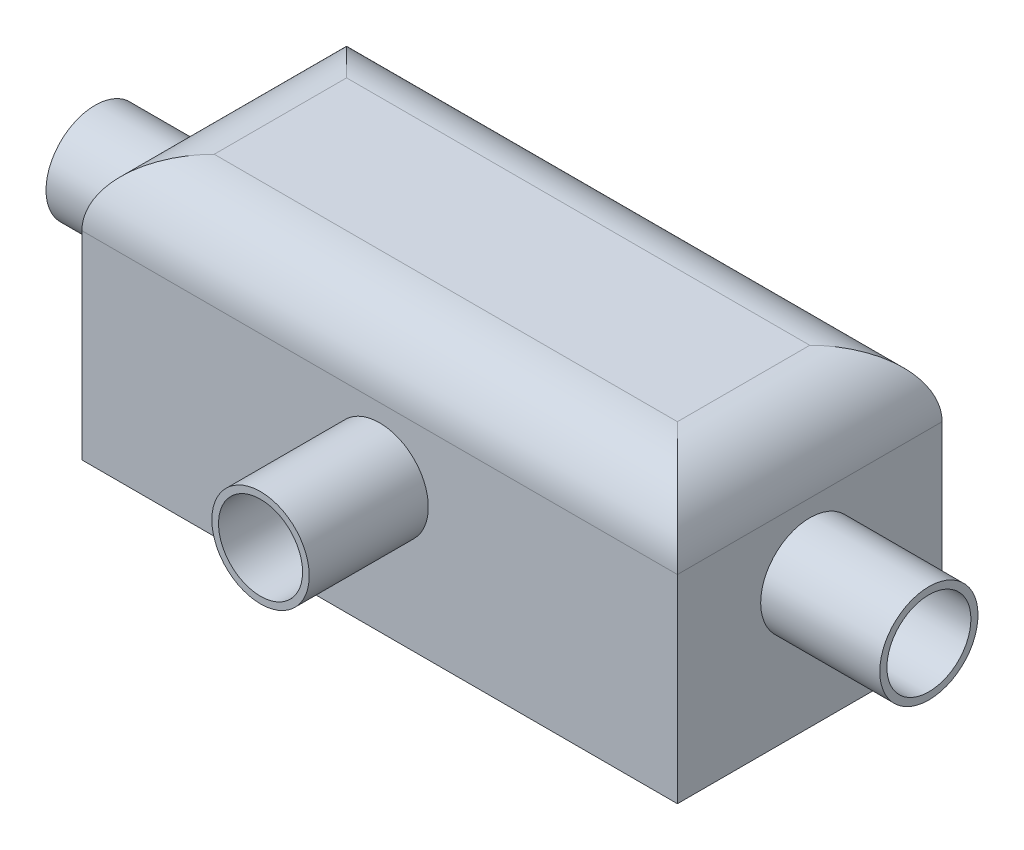
ISO-10303-21;
HEADER;
FILE_DESCRIPTION(('STEP AP214'),'2;1');
FILE_NAME('part.step','',(''),(''),'','','');
FILE_SCHEMA(('AUTOMOTIVE_DESIGN { 1 0 10303 214 1 1 1 1 }'));
ENDSEC;
DATA;
#1=APPLICATION_CONTEXT('core data for automotive mechanical design processes');
#2=APPLICATION_PROTOCOL_DEFINITION('international standard','automotive_design',2000,#1);
#3=PRODUCT_CONTEXT('',#1,'mechanical');
#4=PRODUCT('Part','Part','',(#3));
#5=PRODUCT_RELATED_PRODUCT_CATEGORY('part','',(#4));
#6=PRODUCT_DEFINITION_FORMATION('','',#4);
#7=PRODUCT_DEFINITION_CONTEXT('part definition',#1,'design');
#8=PRODUCT_DEFINITION('design','',#6,#7);
#9=PRODUCT_DEFINITION_SHAPE('','',#8);
#10=(LENGTH_UNIT() NAMED_UNIT(*) SI_UNIT(.MILLI.,.METRE.));
#11=(NAMED_UNIT(*) PLANE_ANGLE_UNIT() SI_UNIT($,.RADIAN.));
#12=(NAMED_UNIT(*) SI_UNIT($,.STERADIAN.) SOLID_ANGLE_UNIT());
#13=UNCERTAINTY_MEASURE_WITH_UNIT(LENGTH_MEASURE(1.E-05),#10,'distance_accuracy_value','');
#14=(GEOMETRIC_REPRESENTATION_CONTEXT(3) GLOBAL_UNCERTAINTY_ASSIGNED_CONTEXT((#13)) GLOBAL_UNIT_ASSIGNED_CONTEXT((#10,
#11,#12)) REPRESENTATION_CONTEXT('',''));
#15=CARTESIAN_POINT('',(0.,0.,0.));
#16=DIRECTION('',(0.,0.,1.));
#17=DIRECTION('',(1.,0.,0.));
#18=AXIS2_PLACEMENT_3D('',#15,#16,#17);
#19=CARTESIAN_POINT('',(45.,40.,-20.));
#20=DIRECTION('',(-1.,0.,0.));
#21=DIRECTION('',(0.,0.,1.));
#22=AXIS2_PLACEMENT_3D('',#19,#20,#21);
#23=PLANE('',#22);
#24=CARTESIAN_POINT('',(45.,20.,0.));
#25=DIRECTION('',(-1.,0.,0.));
#26=DIRECTION('',(0.,0.,1.));
#27=AXIS2_PLACEMENT_3D('',#24,#25,#26);
#28=CIRCLE('',#27,7.42138083143577);
#29=CARTESIAN_POINT('',(45.,20.,7.42138083143575));
#30=VERTEX_POINT('',#29);
#31=EDGE_CURVE('E90',#30,#30,#28,.F.);
#32=ORIENTED_EDGE('',*,*,#31,.F.);
#33=EDGE_LOOP('',(#32));
#34=FACE_BOUND('',#33,.T.);
#35=DIRECTION('',(0.,-1.,0.));
#36=VECTOR('',#35,1.);
#37=CARTESIAN_POINT('',(45.,40.,-20.));
#38=LINE('',#37,#36);
#39=CARTESIAN_POINT('',(45.,30.,-20.));
#40=VERTEX_POINT('',#39);
#41=CARTESIAN_POINT('',(45.,0.,-20.));
#42=VERTEX_POINT('',#41);
#43=EDGE_CURVE('E84',#40,#42,#38,.T.);
#44=ORIENTED_EDGE('',*,*,#43,.F.);
#45=DIRECTION('',(0.,0.,-1.));
#46=VECTOR('',#45,1.);
#47=CARTESIAN_POINT('',(45.,30.,20.));
#48=LINE('',#47,#46);
#49=CARTESIAN_POINT('',(45.,30.,20.));
#50=VERTEX_POINT('',#49);
#51=EDGE_CURVE('E49',#40,#50,#48,.F.);
#52=ORIENTED_EDGE('',*,*,#51,.T.);
#53=DIRECTION('',(0.,-1.,0.));
#54=VECTOR('',#53,1.);
#55=CARTESIAN_POINT('',(45.,40.,20.));
#56=LINE('',#55,#54);
#57=CARTESIAN_POINT('',(45.,0.,20.));
#58=VERTEX_POINT('',#57);
#59=EDGE_CURVE('E101',#50,#58,#56,.T.);
#60=ORIENTED_EDGE('',*,*,#59,.T.);
#61=DIRECTION('',(0.,0.,-1.));
#62=VECTOR('',#61,1.);
#63=CARTESIAN_POINT('',(45.,0.,-20.));
#64=LINE('',#63,#62);
#65=EDGE_CURVE('E97',#58,#42,#64,.T.);
#66=ORIENTED_EDGE('',*,*,#65,.T.);
#67=EDGE_LOOP('',(#44,#52,#60,#66));
#68=FACE_BOUND('',#67,.T.);
#69=ADVANCED_FACE('F32',(#34,#68),#23,.F.);
#70=CARTESIAN_POINT('',(-45.,40.,-20.));
#71=DIRECTION('',(0.,0.,1.));
#72=DIRECTION('',(1.,0.,0.));
#73=AXIS2_PLACEMENT_3D('',#70,#71,#72);
#74=PLANE('',#73);
#75=DIRECTION('',(0.,-1.,0.));
#76=VECTOR('',#75,1.);
#77=CARTESIAN_POINT('',(-45.,40.,-20.));
#78=LINE('',#77,#76);
#79=CARTESIAN_POINT('',(-45.,30.,-20.));
#80=VERTEX_POINT('',#79);
#81=CARTESIAN_POINT('',(-45.,0.,-20.));
#82=VERTEX_POINT('',#81);
#83=EDGE_CURVE('E91',#80,#82,#78,.T.);
#84=ORIENTED_EDGE('',*,*,#83,.F.);
#85=DIRECTION('',(-1.,0.,0.));
#86=VECTOR('',#85,1.);
#87=CARTESIAN_POINT('',(45.,30.,-20.));
#88=LINE('',#87,#86);
#89=EDGE_CURVE('E41',#80,#40,#88,.F.);
#90=ORIENTED_EDGE('',*,*,#89,.T.);
#91=ORIENTED_EDGE('',*,*,#43,.T.);
#92=DIRECTION('',(-1.,0.,0.));
#93=VECTOR('',#92,1.);
#94=CARTESIAN_POINT('',(-45.,0.,-20.));
#95=LINE('',#94,#93);
#96=EDGE_CURVE('E87',#42,#82,#95,.T.);
#97=ORIENTED_EDGE('',*,*,#96,.T.);
#98=EDGE_LOOP('',(#84,#90,#91,#97));
#99=FACE_BOUND('',#98,.T.);
#100=ADVANCED_FACE('F86',(#99),#74,.F.);
#101=CARTESIAN_POINT('',(-45.,40.,-20.));
#102=DIRECTION('',(1.,0.,0.));
#103=DIRECTION('',(0.,0.,-1.));
#104=AXIS2_PLACEMENT_3D('',#101,#102,#103);
#105=PLANE('',#104);
#106=CARTESIAN_POINT('',(-45.,20.,0.));
#107=DIRECTION('',(1.,0.,0.));
#108=DIRECTION('',(0.,0.,-1.));
#109=AXIS2_PLACEMENT_3D('',#106,#107,#108);
#110=CIRCLE('',#109,7.42138083143577);
#111=CARTESIAN_POINT('',(-45.,20.,-7.42138083143576));
#112=VERTEX_POINT('',#111);
#113=EDGE_CURVE('E119',#112,#112,#110,.F.);
#114=ORIENTED_EDGE('',*,*,#113,.F.);
#115=EDGE_LOOP('',(#114));
#116=FACE_BOUND('',#115,.T.);
#117=DIRECTION('',(0.,-1.,0.));
#118=VECTOR('',#117,1.);
#119=CARTESIAN_POINT('',(-45.,40.,20.));
#120=LINE('',#119,#118);
#121=CARTESIAN_POINT('',(-45.,30.,20.));
#122=VERTEX_POINT('',#121);
#123=CARTESIAN_POINT('',(-45.,0.,20.));
#124=VERTEX_POINT('',#123);
#125=EDGE_CURVE('E114',#122,#124,#120,.T.);
#126=ORIENTED_EDGE('',*,*,#125,.F.);
#127=DIRECTION('',(0.,0.,1.));
#128=VECTOR('',#127,1.);
#129=CARTESIAN_POINT('',(-45.,30.,-20.));
#130=LINE('',#129,#128);
#131=EDGE_CURVE('E134',#122,#80,#130,.F.);
#132=ORIENTED_EDGE('',*,*,#131,.T.);
#133=ORIENTED_EDGE('',*,*,#83,.T.);
#134=DIRECTION('',(0.,0.,1.));
#135=VECTOR('',#134,1.);
#136=CARTESIAN_POINT('',(-45.,0.,-20.));
#137=LINE('',#136,#135);
#138=EDGE_CURVE('E99',#82,#124,#137,.T.);
#139=ORIENTED_EDGE('',*,*,#138,.T.);
#140=EDGE_LOOP('',(#126,#132,#133,#139));
#141=FACE_BOUND('',#140,.T.);
#142=ADVANCED_FACE('F201',(#116,#141),#105,.F.);
#143=CARTESIAN_POINT('',(-45.,40.,20.));
#144=DIRECTION('',(0.,0.,-1.));
#145=DIRECTION('',(-1.,0.,0.));
#146=AXIS2_PLACEMENT_3D('',#143,#144,#145);
#147=PLANE('',#146);
#148=CARTESIAN_POINT('',(0.,20.,20.));
#149=DIRECTION('',(0.,0.,-1.));
#150=DIRECTION('',(-1.,0.,0.));
#151=AXIS2_PLACEMENT_3D('',#148,#149,#150);
#152=CIRCLE('',#151,7.35634730711064);
#153=CARTESIAN_POINT('',(-7.35634730711064,20.,20.));
#154=VERTEX_POINT('',#153);
#155=EDGE_CURVE('E122',#154,#154,#152,.F.);
#156=ORIENTED_EDGE('',*,*,#155,.F.);
#157=EDGE_LOOP('',(#156));
#158=FACE_BOUND('',#157,.T.);
#159=ORIENTED_EDGE('',*,*,#59,.F.);
#160=DIRECTION('',(1.,0.,0.));
#161=VECTOR('',#160,1.);
#162=CARTESIAN_POINT('',(-45.,30.,20.));
#163=LINE('',#162,#161);
#164=EDGE_CURVE('E11',#50,#122,#163,.F.);
#165=ORIENTED_EDGE('',*,*,#164,.T.);
#166=ORIENTED_EDGE('',*,*,#125,.T.);
#167=DIRECTION('',(1.,0.,0.));
#168=VECTOR('',#167,1.);
#169=CARTESIAN_POINT('',(-45.,0.,20.));
#170=LINE('',#169,#168);
#171=EDGE_CURVE('E111',#124,#58,#170,.T.);
#172=ORIENTED_EDGE('',*,*,#171,.T.);
#173=EDGE_LOOP('',(#159,#165,#166,#172));
#174=FACE_BOUND('',#173,.T.);
#175=ADVANCED_FACE('F224',(#158,#174),#147,.F.);
#176=CARTESIAN_POINT('',(0.,40.,0.));
#177=DIRECTION('',(0.,1.,0.));
#178=DIRECTION('',(0.,0.,1.));
#179=AXIS2_PLACEMENT_3D('',#176,#177,#178);
#180=PLANE('',#179);
#181=DIRECTION('',(0.,0.,-1.));
#182=VECTOR('',#181,1.);
#183=CARTESIAN_POINT('',(35.,40.,-20.));
#184=LINE('',#183,#182);
#185=CARTESIAN_POINT('',(35.,40.,10.));
#186=VERTEX_POINT('',#185);
#187=CARTESIAN_POINT('',(35.,40.,-10.));
#188=VERTEX_POINT('',#187);
#189=EDGE_CURVE('E127',#186,#188,#184,.T.);
#190=ORIENTED_EDGE('',*,*,#189,.T.);
#191=DIRECTION('',(-1.,0.,0.));
#192=VECTOR('',#191,1.);
#193=CARTESIAN_POINT('',(-45.,40.,-10.));
#194=LINE('',#193,#192);
#195=CARTESIAN_POINT('',(-35.,40.,-10.));
#196=VERTEX_POINT('',#195);
#197=EDGE_CURVE('E132',#188,#196,#194,.T.);
#198=ORIENTED_EDGE('',*,*,#197,.T.);
#199=DIRECTION('',(0.,0.,1.));
#200=VECTOR('',#199,1.);
#201=CARTESIAN_POINT('',(-35.,40.,20.));
#202=LINE('',#201,#200);
#203=CARTESIAN_POINT('',(-35.,40.,10.));
#204=VERTEX_POINT('',#203);
#205=EDGE_CURVE('E129',#196,#204,#202,.T.);
#206=ORIENTED_EDGE('',*,*,#205,.T.);
#207=DIRECTION('',(1.,0.,0.));
#208=VECTOR('',#207,1.);
#209=CARTESIAN_POINT('',(45.,40.,10.));
#210=LINE('',#209,#208);
#211=EDGE_CURVE('E125',#204,#186,#210,.T.);
#212=ORIENTED_EDGE('',*,*,#211,.T.);
#213=EDGE_LOOP('',(#190,#198,#206,#212));
#214=FACE_BOUND('',#213,.T.);
#215=ADVANCED_FACE('F234',(#214),#180,.T.);
#216=CARTESIAN_POINT('',(0.,0.,0.));
#217=DIRECTION('',(0.,1.,0.));
#218=DIRECTION('',(0.,0.,1.));
#219=AXIS2_PLACEMENT_3D('',#216,#217,#218);
#220=PLANE('',#219);
#221=ORIENTED_EDGE('',*,*,#65,.F.);
#222=ORIENTED_EDGE('',*,*,#171,.F.);
#223=ORIENTED_EDGE('',*,*,#138,.F.);
#224=ORIENTED_EDGE('',*,*,#96,.F.);
#225=EDGE_LOOP('',(#221,#222,#223,#224));
#226=FACE_BOUND('',#225,.T.);
#227=ADVANCED_FACE('F95',(#226),#220,.F.);
#228=CARTESIAN_POINT('',(63.,20.,0.));
#229=DIRECTION('',(1.,0.,0.));
#230=DIRECTION('',(0.,0.,-1.));
#231=AXIS2_PLACEMENT_3D('',#228,#229,#230);
#232=PLANE('',#231);
#233=CARTESIAN_POINT('',(63.,20.,0.));
#234=DIRECTION('',(1.,0.,0.));
#235=DIRECTION('',(0.,0.,-1.));
#236=AXIS2_PLACEMENT_3D('',#233,#234,#235);
#237=CIRCLE('',#236,7.42138083143577);
#238=CARTESIAN_POINT('',(63.,20.,-7.42138083143579));
#239=VERTEX_POINT('',#238);
#240=EDGE_CURVE('E103',#239,#239,#237,.T.);
#241=ORIENTED_EDGE('',*,*,#240,.T.);
#242=EDGE_LOOP('',(#241));
#243=FACE_BOUND('',#242,.T.);
#244=CARTESIAN_POINT('',(63.,20.,0.));
#245=DIRECTION('',(1.,0.,0.));
#246=DIRECTION('',(0.,0.,-1.));
#247=AXIS2_PLACEMENT_3D('',#244,#245,#246);
#248=CIRCLE('',#247,6.35);
#249=CARTESIAN_POINT('',(63.,20.,-6.35000000000002));
#250=VERTEX_POINT('',#249);
#251=EDGE_CURVE('E106',#250,#250,#248,.T.);
#252=ORIENTED_EDGE('',*,*,#251,.F.);
#253=EDGE_LOOP('',(#252));
#254=FACE_BOUND('',#253,.T.);
#255=ADVANCED_FACE('F191',(#243,#254),#232,.T.);
#256=CARTESIAN_POINT('',(63.,20.,0.));
#257=DIRECTION('',(-1.,0.,0.));
#258=DIRECTION('',(0.,0.,1.));
#259=AXIS2_PLACEMENT_3D('',#256,#257,#258);
#260=CYLINDRICAL_SURFACE('',#259,7.42138083143577);
#261=ORIENTED_EDGE('',*,*,#240,.F.);
#262=EDGE_LOOP('',(#261));
#263=FACE_BOUND('',#262,.T.);
#264=ORIENTED_EDGE('',*,*,#31,.T.);
#265=EDGE_LOOP('',(#264));
#266=FACE_BOUND('',#265,.T.);
#267=ADVANCED_FACE('F182',(#263,#266),#260,.T.);
#268=CARTESIAN_POINT('',(63.,20.,0.));
#269=DIRECTION('',(-1.,0.,0.));
#270=DIRECTION('',(0.,0.,1.));
#271=AXIS2_PLACEMENT_3D('',#268,#269,#270);
#272=CYLINDRICAL_SURFACE('',#271,6.35);
#273=ORIENTED_EDGE('',*,*,#251,.T.);
#274=EDGE_LOOP('',(#273));
#275=FACE_BOUND('',#274,.T.);
#276=CARTESIAN_POINT('',(45.,20.,0.));
#277=DIRECTION('',(1.,0.,0.));
#278=DIRECTION('',(0.,0.,-1.));
#279=AXIS2_PLACEMENT_3D('',#276,#277,#278);
#280=CIRCLE('',#279,6.35);
#281=CARTESIAN_POINT('',(45.,20.,-6.35000000000002));
#282=VERTEX_POINT('',#281);
#283=EDGE_CURVE('E173',#282,#282,#280,.T.);
#284=ORIENTED_EDGE('',*,*,#283,.F.);
#285=EDGE_LOOP('',(#284));
#286=FACE_BOUND('',#285,.T.);
#287=ADVANCED_FACE('F180',(#275,#286),#272,.F.);
#288=ORIENTED_EDGE('',*,*,#283,.T.);
#289=EDGE_LOOP('',(#288));
#290=FACE_BOUND('',#289,.T.);
#291=ADVANCED_FACE('F178',(#290),#23,.F.);
#292=CARTESIAN_POINT('',(-63.,20.,0.));
#293=DIRECTION('',(-1.,0.,0.));
#294=DIRECTION('',(0.,0.,1.));
#295=AXIS2_PLACEMENT_3D('',#292,#293,#294);
#296=PLANE('',#295);
#297=CARTESIAN_POINT('',(-63.,20.,0.));
#298=DIRECTION('',(-1.,0.,0.));
#299=DIRECTION('',(0.,0.,1.));
#300=AXIS2_PLACEMENT_3D('',#297,#298,#299);
#301=CIRCLE('',#300,7.42138083143577);
#302=CARTESIAN_POINT('',(-63.,20.,7.4213808314358));
#303=VERTEX_POINT('',#302);
#304=EDGE_CURVE('E168',#303,#303,#301,.T.);
#305=ORIENTED_EDGE('',*,*,#304,.T.);
#306=EDGE_LOOP('',(#305));
#307=FACE_BOUND('',#306,.T.);
#308=CARTESIAN_POINT('',(-63.,20.,0.));
#309=DIRECTION('',(-1.,0.,0.));
#310=DIRECTION('',(0.,0.,1.));
#311=AXIS2_PLACEMENT_3D('',#308,#309,#310);
#312=CIRCLE('',#311,6.35);
#313=CARTESIAN_POINT('',(-63.,20.,6.35000000000003));
#314=VERTEX_POINT('',#313);
#315=EDGE_CURVE('E165',#314,#314,#312,.T.);
#316=ORIENTED_EDGE('',*,*,#315,.F.);
#317=EDGE_LOOP('',(#316));
#318=FACE_BOUND('',#317,.T.);
#319=ADVANCED_FACE('F189',(#307,#318),#296,.T.);
#320=CARTESIAN_POINT('',(-63.,20.,0.));
#321=DIRECTION('',(1.,0.,0.));
#322=DIRECTION('',(0.,0.,-1.));
#323=AXIS2_PLACEMENT_3D('',#320,#321,#322);
#324=CYLINDRICAL_SURFACE('',#323,7.42138083143577);
#325=ORIENTED_EDGE('',*,*,#304,.F.);
#326=EDGE_LOOP('',(#325));
#327=FACE_BOUND('',#326,.T.);
#328=ORIENTED_EDGE('',*,*,#113,.T.);
#329=EDGE_LOOP('',(#328));
#330=FACE_BOUND('',#329,.T.);
#331=ADVANCED_FACE('F260',(#327,#330),#324,.T.);
#332=CARTESIAN_POINT('',(-63.,20.,0.));
#333=DIRECTION('',(1.,0.,0.));
#334=DIRECTION('',(0.,0.,-1.));
#335=AXIS2_PLACEMENT_3D('',#332,#333,#334);
#336=CYLINDRICAL_SURFACE('',#335,6.35);
#337=ORIENTED_EDGE('',*,*,#315,.T.);
#338=EDGE_LOOP('',(#337));
#339=FACE_BOUND('',#338,.T.);
#340=CARTESIAN_POINT('',(-45.,20.,0.));
#341=DIRECTION('',(-1.,0.,0.));
#342=DIRECTION('',(0.,0.,1.));
#343=AXIS2_PLACEMENT_3D('',#340,#341,#342);
#344=CIRCLE('',#343,6.35);
#345=CARTESIAN_POINT('',(-45.,20.,6.35000000000002));
#346=VERTEX_POINT('',#345);
#347=EDGE_CURVE('E164',#346,#346,#344,.T.);
#348=ORIENTED_EDGE('',*,*,#347,.F.);
#349=EDGE_LOOP('',(#348));
#350=FACE_BOUND('',#349,.T.);
#351=ADVANCED_FACE('F251',(#339,#350),#336,.F.);
#352=ORIENTED_EDGE('',*,*,#347,.T.);
#353=EDGE_LOOP('',(#352));
#354=FACE_BOUND('',#353,.T.);
#355=ADVANCED_FACE('F245',(#354),#105,.F.);
#356=CARTESIAN_POINT('',(0.,20.,38.));
#357=DIRECTION('',(0.,0.,1.));
#358=DIRECTION('',(1.,0.,0.));
#359=AXIS2_PLACEMENT_3D('',#356,#357,#358);
#360=PLANE('',#359);
#361=CARTESIAN_POINT('',(0.,20.,38.));
#362=DIRECTION('',(0.,0.,1.));
#363=DIRECTION('',(1.,0.,0.));
#364=AXIS2_PLACEMENT_3D('',#361,#362,#363);
#365=CIRCLE('',#364,7.35634730711064);
#366=CARTESIAN_POINT('',(7.35634730711064,20.,38.));
#367=VERTEX_POINT('',#366);
#368=EDGE_CURVE('E159',#367,#367,#365,.T.);
#369=ORIENTED_EDGE('',*,*,#368,.T.);
#370=EDGE_LOOP('',(#369));
#371=FACE_BOUND('',#370,.T.);
#372=CARTESIAN_POINT('',(0.,20.,38.));
#373=DIRECTION('',(0.,0.,1.));
#374=DIRECTION('',(1.,0.,0.));
#375=AXIS2_PLACEMENT_3D('',#372,#373,#374);
#376=CIRCLE('',#375,6.35);
#377=CARTESIAN_POINT('',(6.35,20.,38.));
#378=VERTEX_POINT('',#377);
#379=EDGE_CURVE('E154',#378,#378,#376,.T.);
#380=ORIENTED_EDGE('',*,*,#379,.F.);
#381=EDGE_LOOP('',(#380));
#382=FACE_BOUND('',#381,.T.);
#383=ADVANCED_FACE('F250',(#371,#382),#360,.T.);
#384=CARTESIAN_POINT('',(0.,20.,38.));
#385=DIRECTION('',(0.,0.,-1.));
#386=DIRECTION('',(-1.,0.,0.));
#387=AXIS2_PLACEMENT_3D('',#384,#385,#386);
#388=CYLINDRICAL_SURFACE('',#387,7.35634730711064);
#389=ORIENTED_EDGE('',*,*,#368,.F.);
#390=EDGE_LOOP('',(#389));
#391=FACE_BOUND('',#390,.T.);
#392=ORIENTED_EDGE('',*,*,#155,.T.);
#393=EDGE_LOOP('',(#392));
#394=FACE_BOUND('',#393,.T.);
#395=ADVANCED_FACE('F257',(#391,#394),#388,.T.);
#396=CARTESIAN_POINT('',(0.,20.,38.));
#397=DIRECTION('',(0.,0.,-1.));
#398=DIRECTION('',(-1.,0.,0.));
#399=AXIS2_PLACEMENT_3D('',#396,#397,#398);
#400=CYLINDRICAL_SURFACE('',#399,6.35);
#401=ORIENTED_EDGE('',*,*,#379,.T.);
#402=EDGE_LOOP('',(#401));
#403=FACE_BOUND('',#402,.T.);
#404=CARTESIAN_POINT('',(0.,20.,20.));
#405=DIRECTION('',(0.,0.,1.));
#406=DIRECTION('',(1.,0.,0.));
#407=AXIS2_PLACEMENT_3D('',#404,#405,#406);
#408=CIRCLE('',#407,6.35);
#409=CARTESIAN_POINT('',(6.35,20.,20.));
#410=VERTEX_POINT('',#409);
#411=EDGE_CURVE('E149',#410,#410,#408,.T.);
#412=ORIENTED_EDGE('',*,*,#411,.F.);
#413=EDGE_LOOP('',(#412));
#414=FACE_BOUND('',#413,.T.);
#415=ADVANCED_FACE('F222',(#403,#414),#400,.F.);
#416=ORIENTED_EDGE('',*,*,#411,.T.);
#417=EDGE_LOOP('',(#416));
#418=FACE_BOUND('',#417,.T.);
#419=ADVANCED_FACE('F217',(#418),#147,.F.);
#420=CARTESIAN_POINT('',(35.,30.,0.));
#421=DIRECTION('',(0.,0.,1.));
#422=DIRECTION('',(1.,0.,0.));
#423=AXIS2_PLACEMENT_3D('',#420,#421,#422);
#424=CYLINDRICAL_SURFACE('',#423,10.);
#425=CARTESIAN_POINT('',(35.,30.,10.));
#426=DIRECTION('',(-0.707106781186547,0.,0.707106781186548));
#427=DIRECTION('',(-0.707106781186548,0.,-0.707106781186547));
#428=AXIS2_PLACEMENT_3D('',#425,#426,#427);
#429=ELLIPSE('',#428,14.142135623731,10.);
#430=EDGE_CURVE('E142',#50,#186,#429,.T.);
#431=ORIENTED_EDGE('',*,*,#430,.F.);
#432=ORIENTED_EDGE('',*,*,#51,.F.);
#433=CARTESIAN_POINT('',(35.,30.,-10.));
#434=DIRECTION('',(0.707106781186548,0.,0.707106781186547));
#435=DIRECTION('',(0.707106781186547,0.,-0.707106781186548));
#436=AXIS2_PLACEMENT_3D('',#433,#434,#435);
#437=ELLIPSE('',#436,14.1421356237309,10.);
#438=EDGE_CURVE('E36',#188,#40,#437,.F.);
#439=ORIENTED_EDGE('',*,*,#438,.F.);
#440=ORIENTED_EDGE('',*,*,#189,.F.);
#441=EDGE_LOOP('',(#431,#432,#439,#440));
#442=FACE_BOUND('',#441,.T.);
#443=ADVANCED_FACE('F34',(#442),#424,.T.);
#444=CARTESIAN_POINT('',(0.,30.,-10.));
#445=DIRECTION('',(1.,0.,0.));
#446=DIRECTION('',(0.,0.,-1.));
#447=AXIS2_PLACEMENT_3D('',#444,#445,#446);
#448=CYLINDRICAL_SURFACE('',#447,10.);
#449=ORIENTED_EDGE('',*,*,#438,.T.);
#450=ORIENTED_EDGE('',*,*,#89,.F.);
#451=CARTESIAN_POINT('',(-35.,30.,-10.));
#452=DIRECTION('',(0.707106781186547,0.,-0.707106781186548));
#453=DIRECTION('',(0.707106781186548,0.,0.707106781186547));
#454=AXIS2_PLACEMENT_3D('',#451,#452,#453);
#455=ELLIPSE('',#454,14.142135623731,10.);
#456=EDGE_CURVE('E141',#196,#80,#455,.F.);
#457=ORIENTED_EDGE('',*,*,#456,.F.);
#458=ORIENTED_EDGE('',*,*,#197,.F.);
#459=EDGE_LOOP('',(#449,#450,#457,#458));
#460=FACE_BOUND('',#459,.T.);
#461=ADVANCED_FACE('F212',(#460),#448,.T.);
#462=CARTESIAN_POINT('',(0.,30.,10.));
#463=DIRECTION('',(-1.,0.,0.));
#464=DIRECTION('',(0.,0.,1.));
#465=AXIS2_PLACEMENT_3D('',#462,#463,#464);
#466=CYLINDRICAL_SURFACE('',#465,10.);
#467=ORIENTED_EDGE('',*,*,#430,.T.);
#468=ORIENTED_EDGE('',*,*,#211,.F.);
#469=CARTESIAN_POINT('',(-35.,30.,10.));
#470=DIRECTION('',(-0.707106781186548,0.,-0.707106781186547));
#471=DIRECTION('',(-0.707106781186547,0.,0.707106781186548));
#472=AXIS2_PLACEMENT_3D('',#469,#470,#471);
#473=ELLIPSE('',#472,14.1421356237309,10.);
#474=EDGE_CURVE('E139',#122,#204,#473,.T.);
#475=ORIENTED_EDGE('',*,*,#474,.F.);
#476=ORIENTED_EDGE('',*,*,#164,.F.);
#477=EDGE_LOOP('',(#467,#468,#475,#476));
#478=FACE_BOUND('',#477,.T.);
#479=ADVANCED_FACE('F209',(#478),#466,.T.);
#480=CARTESIAN_POINT('',(-35.,30.,0.));
#481=DIRECTION('',(0.,0.,-1.));
#482=DIRECTION('',(-1.,0.,0.));
#483=AXIS2_PLACEMENT_3D('',#480,#481,#482);
#484=CYLINDRICAL_SURFACE('',#483,10.);
#485=ORIENTED_EDGE('',*,*,#456,.T.);
#486=ORIENTED_EDGE('',*,*,#131,.F.);
#487=ORIENTED_EDGE('',*,*,#474,.T.);
#488=ORIENTED_EDGE('',*,*,#205,.F.);
#489=EDGE_LOOP('',(#485,#486,#487,#488));
#490=FACE_BOUND('',#489,.T.);
#491=ADVANCED_FACE('F206',(#490),#484,.T.);
#492=CLOSED_SHELL('',(#69,#100,#142,#175,#215,#227,#255,#267,#287,#291,#319,#331,#351,#355,#383,
#395,#415,#419,#443,#461,#479,#491));
#493=MANIFOLD_SOLID_BREP('B2',#492);
#494=ADVANCED_BREP_SHAPE_REPRESENTATION('',(#18,#493),#14);
#495=SHAPE_DEFINITION_REPRESENTATION(#9,#494);
ENDSEC;
END-ISO-10303-21;
